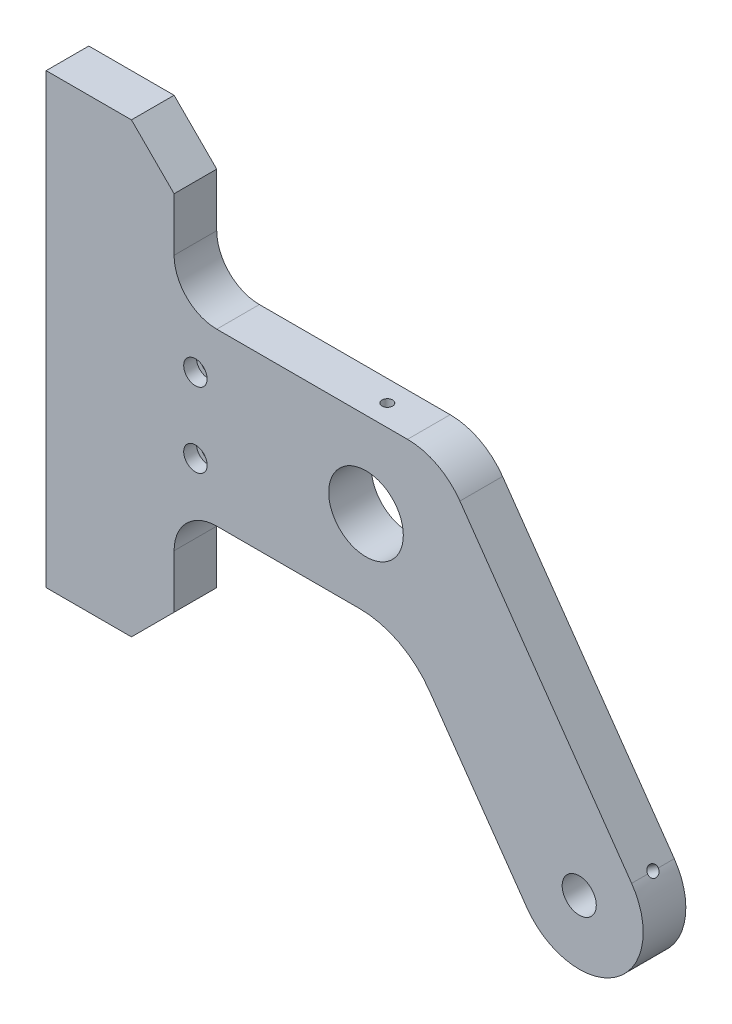
ISO-10303-21;
HEADER;
FILE_DESCRIPTION(('STEP AP214'),'2;1');
FILE_NAME('part.step','',(''),(''),'','','');
FILE_SCHEMA(('AUTOMOTIVE_DESIGN { 1 0 10303 214 1 1 1 1 }'));
ENDSEC;
DATA;
#1=APPLICATION_CONTEXT('core data for automotive mechanical design processes');
#2=APPLICATION_PROTOCOL_DEFINITION('international standard','automotive_design',2000,#1);
#3=PRODUCT_CONTEXT('',#1,'mechanical');
#4=PRODUCT('Part','Part','',(#3));
#5=PRODUCT_RELATED_PRODUCT_CATEGORY('part','',(#4));
#6=PRODUCT_DEFINITION_FORMATION('','',#4);
#7=PRODUCT_DEFINITION_CONTEXT('part definition',#1,'design');
#8=PRODUCT_DEFINITION('design','',#6,#7);
#9=PRODUCT_DEFINITION_SHAPE('','',#8);
#10=(LENGTH_UNIT() NAMED_UNIT(*) SI_UNIT(.MILLI.,.METRE.));
#11=(NAMED_UNIT(*) PLANE_ANGLE_UNIT() SI_UNIT($,.RADIAN.));
#12=(NAMED_UNIT(*) SI_UNIT($,.STERADIAN.) SOLID_ANGLE_UNIT());
#13=UNCERTAINTY_MEASURE_WITH_UNIT(LENGTH_MEASURE(1.E-05),#10,'distance_accuracy_value','');
#14=(GEOMETRIC_REPRESENTATION_CONTEXT(3) GLOBAL_UNCERTAINTY_ASSIGNED_CONTEXT((#13)) GLOBAL_UNIT_ASSIGNED_CONTEXT((#10,
#11,#12)) REPRESENTATION_CONTEXT('',''));
#15=CARTESIAN_POINT('',(0.,0.,0.));
#16=DIRECTION('',(0.,0.,1.));
#17=DIRECTION('',(1.,0.,0.));
#18=AXIS2_PLACEMENT_3D('',#15,#16,#17);
#19=CARTESIAN_POINT('',(60.,145.,10.));
#20=DIRECTION('',(-1.,0.,0.));
#21=DIRECTION('',(0.,-1.,0.));
#22=AXIS2_PLACEMENT_3D('',#19,#20,#21);
#23=PLANE('',#22);
#24=DIRECTION('',(0.,1.,0.));
#25=VECTOR('',#24,1.);
#26=CARTESIAN_POINT('',(60.,145.,10.));
#27=LINE('',#26,#25);
#28=CARTESIAN_POINT('',(60.,165.,10.));
#29=VERTEX_POINT('',#28);
#30=CARTESIAN_POINT('',(60.,190.,10.));
#31=VERTEX_POINT('',#30);
#32=EDGE_CURVE('E256',#29,#31,#27,.T.);
#33=ORIENTED_EDGE('',*,*,#32,.F.);
#34=DIRECTION('',(0.,0.,-1.));
#35=VECTOR('',#34,1.);
#36=CARTESIAN_POINT('',(60.,165.,-10.));
#37=LINE('',#36,#35);
#38=CARTESIAN_POINT('',(60.,165.,-10.));
#39=VERTEX_POINT('',#38);
#40=EDGE_CURVE('E341',#29,#39,#37,.T.);
#41=ORIENTED_EDGE('',*,*,#40,.T.);
#42=DIRECTION('',(0.,1.,0.));
#43=VECTOR('',#42,1.);
#44=CARTESIAN_POINT('',(60.,145.,-10.));
#45=LINE('',#44,#43);
#46=CARTESIAN_POINT('',(60.,190.,-10.));
#47=VERTEX_POINT('',#46);
#48=EDGE_CURVE('E255',#39,#47,#45,.T.);
#49=ORIENTED_EDGE('',*,*,#48,.T.);
#50=DIRECTION('',(0.,0.,1.));
#51=VECTOR('',#50,1.);
#52=CARTESIAN_POINT('',(60.,190.,10.));
#53=LINE('',#52,#51);
#54=EDGE_CURVE('E333',#47,#31,#53,.T.);
#55=ORIENTED_EDGE('',*,*,#54,.T.);
#56=EDGE_LOOP('',(#33,#41,#49,#55));
#57=FACE_BOUND('',#56,.T.);
#58=ADVANCED_FACE('F38',(#57),#23,.F.);
#59=CARTESIAN_POINT('',(0.,210.,10.));
#60=DIRECTION('',(0.,-1.,0.));
#61=DIRECTION('',(0.,0.,-1.));
#62=AXIS2_PLACEMENT_3D('',#59,#60,#61);
#63=PLANE('',#62);
#64=DIRECTION('',(-1.,0.,0.));
#65=VECTOR('',#64,1.);
#66=CARTESIAN_POINT('',(0.,210.,10.));
#67=LINE('',#66,#65);
#68=CARTESIAN_POINT('',(40.,210.,10.));
#69=VERTEX_POINT('',#68);
#70=CARTESIAN_POINT('',(0.,210.,10.));
#71=VERTEX_POINT('',#70);
#72=EDGE_CURVE('E258',#69,#71,#67,.T.);
#73=ORIENTED_EDGE('',*,*,#72,.F.);
#74=DIRECTION('',(0.,0.,-1.));
#75=VECTOR('',#74,1.);
#76=CARTESIAN_POINT('',(40.,210.,10.));
#77=LINE('',#76,#75);
#78=CARTESIAN_POINT('',(40.,210.,-10.));
#79=VERTEX_POINT('',#78);
#80=EDGE_CURVE('E330',#69,#79,#77,.T.);
#81=ORIENTED_EDGE('',*,*,#80,.T.);
#82=DIRECTION('',(-1.,0.,0.));
#83=VECTOR('',#82,1.);
#84=CARTESIAN_POINT('',(0.,210.,-10.));
#85=LINE('',#84,#83);
#86=CARTESIAN_POINT('',(0.,210.,-10.));
#87=VERTEX_POINT('',#86);
#88=EDGE_CURVE('E283',#79,#87,#85,.T.);
#89=ORIENTED_EDGE('',*,*,#88,.T.);
#90=DIRECTION('',(0.,0.,-1.));
#91=VECTOR('',#90,1.);
#92=CARTESIAN_POINT('',(0.,210.,10.));
#93=LINE('',#92,#91);
#94=EDGE_CURVE('E313',#71,#87,#93,.T.);
#95=ORIENTED_EDGE('',*,*,#94,.F.);
#96=EDGE_LOOP('',(#73,#81,#89,#95));
#97=FACE_BOUND('',#96,.T.);
#98=ADVANCED_FACE('F394',(#97),#63,.F.);
#99=CARTESIAN_POINT('',(0.,210.,10.));
#100=DIRECTION('',(1.,0.,0.));
#101=DIRECTION('',(0.,0.,-1.));
#102=AXIS2_PLACEMENT_3D('',#99,#100,#101);
#103=PLANE('',#102);
#104=CARTESIAN_POINT('',(0.,195.,0.));
#105=DIRECTION('',(-1.,0.,0.));
#106=DIRECTION('',(0.,0.,1.));
#107=AXIS2_PLACEMENT_3D('',#104,#105,#106);
#108=CIRCLE('',#107,4.25);
#109=CARTESIAN_POINT('',(0.,195.,4.24999999999999));
#110=VERTEX_POINT('',#109);
#111=EDGE_CURVE('E231',#110,#110,#108,.T.);
#112=ORIENTED_EDGE('',*,*,#111,.F.);
#113=EDGE_LOOP('',(#112));
#114=FACE_BOUND('',#113,.T.);
#115=CARTESIAN_POINT('',(0.,135.,0.));
#116=DIRECTION('',(-1.,0.,0.));
#117=DIRECTION('',(0.,0.,1.));
#118=AXIS2_PLACEMENT_3D('',#115,#116,#117);
#119=CIRCLE('',#118,4.25);
#120=CARTESIAN_POINT('',(0.,135.,4.25000000000001));
#121=VERTEX_POINT('',#120);
#122=EDGE_CURVE('E237',#121,#121,#119,.T.);
#123=ORIENTED_EDGE('',*,*,#122,.F.);
#124=EDGE_LOOP('',(#123));
#125=FACE_BOUND('',#124,.T.);
#126=CARTESIAN_POINT('',(0.,75.,0.));
#127=DIRECTION('',(-1.,0.,0.));
#128=DIRECTION('',(0.,0.,1.));
#129=AXIS2_PLACEMENT_3D('',#126,#127,#128);
#130=CIRCLE('',#129,4.25);
#131=CARTESIAN_POINT('',(0.,75.,4.25000000000001));
#132=VERTEX_POINT('',#131);
#133=EDGE_CURVE('E243',#132,#132,#130,.T.);
#134=ORIENTED_EDGE('',*,*,#133,.F.);
#135=EDGE_LOOP('',(#134));
#136=FACE_BOUND('',#135,.T.);
#137=CARTESIAN_POINT('',(0.,15.,0.));
#138=DIRECTION('',(-1.,0.,0.));
#139=DIRECTION('',(0.,0.,1.));
#140=AXIS2_PLACEMENT_3D('',#137,#138,#139);
#141=CIRCLE('',#140,4.25);
#142=CARTESIAN_POINT('',(0.,15.,4.25000000000001));
#143=VERTEX_POINT('',#142);
#144=EDGE_CURVE('E249',#143,#143,#141,.T.);
#145=ORIENTED_EDGE('',*,*,#144,.F.);
#146=EDGE_LOOP('',(#145));
#147=FACE_BOUND('',#146,.T.);
#148=DIRECTION('',(0.,-1.,0.));
#149=VECTOR('',#148,1.);
#150=CARTESIAN_POINT('',(0.,210.,-10.));
#151=LINE('',#150,#149);
#152=CARTESIAN_POINT('',(0.,0.,-10.));
#153=VERTEX_POINT('',#152);
#154=EDGE_CURVE('E285',#87,#153,#151,.T.);
#155=ORIENTED_EDGE('',*,*,#154,.T.);
#156=DIRECTION('',(0.,0.,-1.));
#157=VECTOR('',#156,1.);
#158=CARTESIAN_POINT('',(0.,0.,10.));
#159=LINE('',#158,#157);
#160=CARTESIAN_POINT('',(0.,0.,10.));
#161=VERTEX_POINT('',#160);
#162=EDGE_CURVE('E310',#161,#153,#159,.T.);
#163=ORIENTED_EDGE('',*,*,#162,.F.);
#164=DIRECTION('',(0.,-1.,0.));
#165=VECTOR('',#164,1.);
#166=CARTESIAN_POINT('',(0.,210.,10.));
#167=LINE('',#166,#165);
#168=EDGE_CURVE('E261',#71,#161,#167,.T.);
#169=ORIENTED_EDGE('',*,*,#168,.F.);
#170=ORIENTED_EDGE('',*,*,#94,.T.);
#171=EDGE_LOOP('',(#155,#163,#169,#170));
#172=FACE_BOUND('',#171,.T.);
#173=ADVANCED_FACE('F400',(#114,#125,#136,#147,#172),#103,.F.);
#174=CARTESIAN_POINT('',(60.0000000000001,0.,10.));
#175=DIRECTION('',(0.,1.,0.));
#176=DIRECTION('',(0.,0.,1.));
#177=AXIS2_PLACEMENT_3D('',#174,#175,#176);
#178=PLANE('',#177);
#179=DIRECTION('',(1.,0.,0.));
#180=VECTOR('',#179,1.);
#181=CARTESIAN_POINT('',(60.0000000000001,0.,-10.));
#182=LINE('',#181,#180);
#183=CARTESIAN_POINT('',(40.,0.,-10.));
#184=VERTEX_POINT('',#183);
#185=EDGE_CURVE('E287',#153,#184,#182,.T.);
#186=ORIENTED_EDGE('',*,*,#185,.T.);
#187=DIRECTION('',(0.,0.,1.));
#188=VECTOR('',#187,1.);
#189=CARTESIAN_POINT('',(40.,0.,10.));
#190=LINE('',#189,#188);
#191=CARTESIAN_POINT('',(40.,0.,10.));
#192=VERTEX_POINT('',#191);
#193=EDGE_CURVE('E324',#184,#192,#190,.T.);
#194=ORIENTED_EDGE('',*,*,#193,.T.);
#195=DIRECTION('',(1.,0.,0.));
#196=VECTOR('',#195,1.);
#197=CARTESIAN_POINT('',(60.0000000000001,0.,10.));
#198=LINE('',#197,#196);
#199=EDGE_CURVE('E263',#161,#192,#198,.T.);
#200=ORIENTED_EDGE('',*,*,#199,.F.);
#201=ORIENTED_EDGE('',*,*,#162,.T.);
#202=EDGE_LOOP('',(#186,#194,#200,#201));
#203=FACE_BOUND('',#202,.T.);
#204=ADVANCED_FACE('F502',(#203),#178,.F.);
#205=CARTESIAN_POINT('',(60.,65.,10.));
#206=DIRECTION('',(-1.,0.,0.));
#207=DIRECTION('',(0.,-1.,0.));
#208=AXIS2_PLACEMENT_3D('',#205,#206,#207);
#209=PLANE('',#208);
#210=DIRECTION('',(0.,1.,0.));
#211=VECTOR('',#210,1.);
#212=CARTESIAN_POINT('',(60.,65.,-10.));
#213=LINE('',#212,#211);
#214=CARTESIAN_POINT('',(60.0000000000001,20.,-10.));
#215=VERTEX_POINT('',#214);
#216=CARTESIAN_POINT('',(60.,45.,-10.));
#217=VERTEX_POINT('',#216);
#218=EDGE_CURVE('E290',#215,#217,#213,.T.);
#219=ORIENTED_EDGE('',*,*,#218,.T.);
#220=DIRECTION('',(0.,0.,-1.));
#221=VECTOR('',#220,1.);
#222=CARTESIAN_POINT('',(60.,45.,10.));
#223=LINE('',#222,#221);
#224=CARTESIAN_POINT('',(60.,45.,10.));
#225=VERTEX_POINT('',#224);
#226=EDGE_CURVE('E339',#217,#225,#223,.F.);
#227=ORIENTED_EDGE('',*,*,#226,.T.);
#228=DIRECTION('',(0.,1.,0.));
#229=VECTOR('',#228,1.);
#230=CARTESIAN_POINT('',(60.,65.,10.));
#231=LINE('',#230,#229);
#232=CARTESIAN_POINT('',(60.,19.9999999999999,10.));
#233=VERTEX_POINT('',#232);
#234=EDGE_CURVE('E266',#233,#225,#231,.T.);
#235=ORIENTED_EDGE('',*,*,#234,.F.);
#236=DIRECTION('',(0.,0.,-1.));
#237=VECTOR('',#236,1.);
#238=CARTESIAN_POINT('',(60.,20.,10.));
#239=LINE('',#238,#237);
#240=EDGE_CURVE('E316',#233,#215,#239,.T.);
#241=ORIENTED_EDGE('',*,*,#240,.T.);
#242=EDGE_LOOP('',(#219,#227,#235,#241));
#243=FACE_BOUND('',#242,.T.);
#244=ADVANCED_FACE('F461',(#243),#209,.F.);
#245=CARTESIAN_POINT('',(60.,65.,10.));
#246=DIRECTION('',(0.,1.,0.));
#247=DIRECTION('',(0.,0.,1.));
#248=AXIS2_PLACEMENT_3D('',#245,#246,#247);
#249=PLANE('',#248);
#250=DIRECTION('',(1.,0.,0.));
#251=VECTOR('',#250,1.);
#252=CARTESIAN_POINT('',(60.,65.,-10.));
#253=LINE('',#252,#251);
#254=CARTESIAN_POINT('',(80.,65.,-10.));
#255=VERTEX_POINT('',#254);
#256=CARTESIAN_POINT('',(147.040590331456,65.,-10.));
#257=VERTEX_POINT('',#256);
#258=EDGE_CURVE('E293',#255,#257,#253,.T.);
#259=ORIENTED_EDGE('',*,*,#258,.T.);
#260=DIRECTION('',(0.,0.,-1.));
#261=VECTOR('',#260,1.);
#262=CARTESIAN_POINT('',(147.040590331456,65.,10.));
#263=LINE('',#262,#261);
#264=CARTESIAN_POINT('',(147.040590331456,65.,10.));
#265=VERTEX_POINT('',#264);
#266=EDGE_CURVE('E368',#257,#265,#263,.F.);
#267=ORIENTED_EDGE('',*,*,#266,.T.);
#268=DIRECTION('',(1.,0.,0.));
#269=VECTOR('',#268,1.);
#270=CARTESIAN_POINT('',(60.,65.,10.));
#271=LINE('',#270,#269);
#272=CARTESIAN_POINT('',(80.,65.,10.));
#273=VERTEX_POINT('',#272);
#274=EDGE_CURVE('E269',#273,#265,#271,.T.);
#275=ORIENTED_EDGE('',*,*,#274,.F.);
#276=DIRECTION('',(0.,0.,-1.));
#277=VECTOR('',#276,1.);
#278=CARTESIAN_POINT('',(80.,65.,-10.));
#279=LINE('',#278,#277);
#280=EDGE_CURVE('E336',#273,#255,#279,.T.);
#281=ORIENTED_EDGE('',*,*,#280,.T.);
#282=EDGE_LOOP('',(#259,#267,#275,#281));
#283=FACE_BOUND('',#282,.T.);
#284=ADVANCED_FACE('F468',(#283),#249,.F.);
#285=CARTESIAN_POINT('',(167.863272353526,65.,10.));
#286=DIRECTION('',(0.819152044288993,0.573576436351044,0.));
#287=DIRECTION('',(-0.573576436351044,0.819152044288993,0.));
#288=AXIS2_PLACEMENT_3D('',#285,#286,#287);
#289=PLANE('',#288);
#290=DIRECTION('',(0.573576436351044,-0.819152044288993,0.));
#291=VECTOR('',#290,1.);
#292=CARTESIAN_POINT('',(167.863272353526,65.,10.));
#293=LINE('',#292,#291);
#294=CARTESIAN_POINT('',(179.806672103015,47.9430574540418,10.));
#295=VERTEX_POINT('',#294);
#296=CARTESIAN_POINT('',(225.42543867133,-17.2072930905313,10.));
#297=VERTEX_POINT('',#296);
#298=EDGE_CURVE('E272',#295,#297,#293,.T.);
#299=ORIENTED_EDGE('',*,*,#298,.F.);
#300=DIRECTION('',(0.,0.,-1.));
#301=VECTOR('',#300,1.);
#302=CARTESIAN_POINT('',(179.806672103015,47.9430574540418,-10.));
#303=LINE('',#302,#301);
#304=CARTESIAN_POINT('',(179.806672103015,47.9430574540418,-10.));
#305=VERTEX_POINT('',#304);
#306=EDGE_CURVE('E365',#295,#305,#303,.T.);
#307=ORIENTED_EDGE('',*,*,#306,.T.);
#308=DIRECTION('',(0.573576436351044,-0.819152044288993,0.));
#309=VECTOR('',#308,1.);
#310=CARTESIAN_POINT('',(167.863272353526,65.,-10.));
#311=LINE('',#310,#309);
#312=CARTESIAN_POINT('',(225.42543867133,-17.2072930905313,-10.));
#313=VERTEX_POINT('',#312);
#314=EDGE_CURVE('E295',#305,#313,#311,.T.);
#315=ORIENTED_EDGE('',*,*,#314,.T.);
#316=DIRECTION('',(0.,0.,-1.));
#317=VECTOR('',#316,1.);
#318=CARTESIAN_POINT('',(225.42543867133,-17.2072930905313,10.));
#319=LINE('',#318,#317);
#320=EDGE_CURVE('E307',#297,#313,#319,.T.);
#321=ORIENTED_EDGE('',*,*,#320,.F.);
#322=EDGE_LOOP('',(#299,#307,#315,#321));
#323=FACE_BOUND('',#322,.T.);
#324=ADVANCED_FACE('F474',(#323),#289,.F.);
#325=CARTESIAN_POINT('',(250.,0.,10.));
#326=DIRECTION('',(0.,0.,-1.));
#327=DIRECTION('',(-1.,0.,0.));
#328=AXIS2_PLACEMENT_3D('',#325,#326,#327);
#329=CYLINDRICAL_SURFACE('',#328,30.);
#330=DIRECTION('',(0.,0.,-1.));
#331=VECTOR('',#330,1.);
#332=CARTESIAN_POINT('',(274.57456132867,17.2072930905313,10.));
#333=LINE('',#332,#331);
#334=CARTESIAN_POINT('',(274.57456132867,17.2072930905313,-2.5));
#335=VERTEX_POINT('',#334);
#336=CARTESIAN_POINT('',(274.57456132867,17.2072930905313,-10.));
#337=VERTEX_POINT('',#336);
#338=EDGE_CURVE('E281',#335,#337,#333,.T.);
#339=ORIENTED_EDGE('',*,*,#338,.F.);
#340=CARTESIAN_POINT('',(274.57456132867,17.2072930905313,-2.5));
#341=CARTESIAN_POINT('',(274.61481999473,17.1498019203188,-2.500006877275));
#342=CARTESIAN_POINT('',(274.654871106441,17.0921695184484,-2.49704443774055));
#343=CARTESIAN_POINT('',(274.734287166767,16.9770401153053,-2.48523416927883));
#344=CARTESIAN_POINT('',(274.773652156812,16.9195431060398,-2.47638669697652));
#345=CARTESIAN_POINT('',(274.851397027578,16.8051436013599,-2.45286952773237));
#346=CARTESIAN_POINT('',(274.889777712011,16.7482406449598,-2.43820475308302));
#347=CARTESIAN_POINT('',(274.965326220443,16.6354172116039,-2.40317382061259));
#348=CARTESIAN_POINT('',(275.002494055907,16.5794967253644,-2.3828077166966));
#349=CARTESIAN_POINT('',(275.111853140987,16.413782952398,-2.31332896419825));
#350=CARTESIAN_POINT('',(275.181937690694,16.3059817300875,-2.25582438256133));
#351=CARTESIAN_POINT('',(275.31460761795,16.0992479709045,-2.12016896488944));
#352=CARTESIAN_POINT('',(275.377194074134,16.0003141589309,-2.04202110368186));
#353=CARTESIAN_POINT('',(275.493683162479,15.8140512954777,-1.86706855029736));
#354=CARTESIAN_POINT('',(275.547566652312,15.7267478971895,-1.77022373318934));
#355=CARTESIAN_POINT('',(275.645371669829,15.5667508837973,-1.56070463863823));
#356=CARTESIAN_POINT('',(275.689291677398,15.4940594982203,-1.44802794998928));
#357=CARTESIAN_POINT('',(275.766371297649,15.3655378398461,-1.20985117256001));
#358=CARTESIAN_POINT('',(275.799515391872,15.3097318918182,-1.08433292932385));
#359=CARTESIAN_POINT('',(275.854340809412,15.2169636314275,-0.824171023758104));
#360=CARTESIAN_POINT('',(275.87602303169,15.1799998412745,-0.689528078017478));
#361=CARTESIAN_POINT('',(275.907503404368,15.1262105751377,-0.415263218903863));
#362=CARTESIAN_POINT('',(275.91732903418,15.1093385347437,-0.27565359335934));
#363=CARTESIAN_POINT('',(275.925015104965,15.0961469636475,0.00486204201485029));
#364=CARTESIAN_POINT('',(275.922875476762,15.0998275517684,0.145768059334784));
#365=CARTESIAN_POINT('',(275.906688959481,15.1275813742875,0.424499498546434));
#366=CARTESIAN_POINT('',(275.892672061787,15.1516032446551,0.562331783059617));
#367=CARTESIAN_POINT('',(275.85301690918,15.2191667973535,0.831380295288021));
#368=CARTESIAN_POINT('',(275.827378596165,15.2627085772756,0.962596489921973));
#369=CARTESIAN_POINT('',(275.764900075831,15.3679424342488,1.21488016249687));
#370=CARTESIAN_POINT('',(275.728045647694,15.4296575498796,1.33593450626654));
#371=CARTESIAN_POINT('',(275.643833009399,15.5692147404415,1.56430830345195));
#372=CARTESIAN_POINT('',(275.596475068604,15.6470564018017,1.67162810898053));
#373=CARTESIAN_POINT('',(275.492030556044,15.8166463840881,1.86982327032534));
#374=CARTESIAN_POINT('',(275.434915944178,15.9084347003992,1.96064962775038));
#375=CARTESIAN_POINT('',(275.312233973644,16.1029191479106,2.122927357614));
#376=CARTESIAN_POINT('',(275.24666401998,16.2056186261008,2.19437276094191));
#377=CARTESIAN_POINT('',(275.108548025427,16.4187989146002,2.31585475750467));
#378=CARTESIAN_POINT('',(275.035997111197,16.5292851461585,2.36587626017093));
#379=CARTESIAN_POINT('',(274.885789479614,16.7545731613126,2.44293745621851));
#380=CARTESIAN_POINT('',(274.808140699051,16.8693681227111,2.47001200216307));
#381=CARTESIAN_POINT('',(274.703548963225,17.0216546425912,2.49017420161541));
#382=CARTESIAN_POINT('',(274.677890943428,17.0588321640836,2.4938607445247));
#383=CARTESIAN_POINT('',(274.626373694636,17.1331184754711,2.49877030379815));
#384=CARTESIAN_POINT('',(274.60051487261,17.1702272765812,2.49999741876936));
#385=CARTESIAN_POINT('',(274.57456132867,17.2072930905313,2.5));
#386=B_SPLINE_CURVE_WITH_KNOTS('',3,(#340,#341,#342,#343,#344,#345,#346,#347,#348,#349,#350,
#351,#352,#353,#354,#355,#356,#357,#358,#359,#360,#361,#362,#363,#364,#365,#366,#367,#368,#369,
#370,#371,#372,#373,#374,#375,#376,#377,#378,#379,#380,#381,#382,#383,#384,#385),.UNSPECIFIED.,
.F.,.F.,(4,2,2,2,2,2,2,2,2,2,2,2,2,2,2,2,2,2,2,2,2,2,4),(0.,0.210487340073488,0.420961926063155,
0.631258798214532,0.841553682111946,1.26194148167382,1.68226873370753,2.10350827023465,
2.52481203153826,2.94671985492192,3.36859458298909,3.78948966423426,4.2103871788481,
4.63022503825764,5.0500649967004,5.47043950013234,5.89080322424802,6.3123960244243,
6.73411852328504,7.15613758847022,7.57751452321119,7.71343288735025,7.84912455620549),.UNSPECIFIED.);
#387=CARTESIAN_POINT('',(274.57456132867,17.2072930905313,2.5));
#388=VERTEX_POINT('',#387);
#389=EDGE_CURVE('E11',#335,#388,#386,.T.);
#390=ORIENTED_EDGE('',*,*,#389,.T.);
#391=CARTESIAN_POINT('',(274.57456132867,17.2072930905313,10.));
#392=VERTEX_POINT('',#391);
#393=EDGE_CURVE('E304',#392,#388,#333,.T.);
#394=ORIENTED_EDGE('',*,*,#393,.F.);
#395=CARTESIAN_POINT('',(250.,0.,10.));
#396=DIRECTION('',(0.,0.,1.));
#397=DIRECTION('',(1.,0.,0.));
#398=AXIS2_PLACEMENT_3D('',#395,#396,#397);
#399=CIRCLE('',#398,30.);
#400=EDGE_CURVE('E274',#297,#392,#399,.T.);
#401=ORIENTED_EDGE('',*,*,#400,.F.);
#402=ORIENTED_EDGE('',*,*,#320,.T.);
#403=CARTESIAN_POINT('',(250.,0.,-10.));
#404=DIRECTION('',(0.,0.,1.));
#405=DIRECTION('',(1.,0.,0.));
#406=AXIS2_PLACEMENT_3D('',#403,#404,#405);
#407=CIRCLE('',#406,30.);
#408=EDGE_CURVE('E297',#313,#337,#407,.T.);
#409=ORIENTED_EDGE('',*,*,#408,.T.);
#410=EDGE_LOOP('',(#339,#390,#394,#401,#402,#409));
#411=FACE_BOUND('',#410,.T.);
#412=ADVANCED_FACE('F480',(#411),#329,.T.);
#413=CARTESIAN_POINT('',(274.57456132867,17.2072930905313,10.));
#414=DIRECTION('',(-0.819152044288993,-0.573576436351044,0.));
#415=DIRECTION('',(0.573576436351044,-0.819152044288993,0.));
#416=AXIS2_PLACEMENT_3D('',#413,#414,#415);
#417=PLANE('',#416);
#418=ORIENTED_EDGE('',*,*,#393,.T.);
#419=CARTESIAN_POINT('',(274.57456132867,17.2072930905313,0.));
#420=DIRECTION('',(0.819152044288993,0.573576436351044,0.));
#421=DIRECTION('',(-0.573576436351044,0.819152044288993,0.));
#422=AXIS2_PLACEMENT_3D('',#419,#420,#421);
#423=CIRCLE('',#422,2.5);
#424=EDGE_CURVE('E58',#335,#388,#423,.T.);
#425=ORIENTED_EDGE('',*,*,#424,.F.);
#426=ORIENTED_EDGE('',*,*,#338,.T.);
#427=DIRECTION('',(-0.573576436351044,0.819152044288993,0.));
#428=VECTOR('',#427,1.);
#429=CARTESIAN_POINT('',(274.57456132867,17.2072930905313,-10.));
#430=LINE('',#429,#428);
#431=CARTESIAN_POINT('',(194.050694434554,132.207293090531,-10.));
#432=VERTEX_POINT('',#431);
#433=EDGE_CURVE('E300',#337,#432,#430,.T.);
#434=ORIENTED_EDGE('',*,*,#433,.T.);
#435=DIRECTION('',(0.,0.,-1.));
#436=VECTOR('',#435,1.);
#437=CARTESIAN_POINT('',(194.050694434554,132.207293090531,10.));
#438=LINE('',#437,#436);
#439=CARTESIAN_POINT('',(194.050694434554,132.207293090531,10.));
#440=VERTEX_POINT('',#439);
#441=EDGE_CURVE('E361',#432,#440,#438,.F.);
#442=ORIENTED_EDGE('',*,*,#441,.T.);
#443=DIRECTION('',(-0.573576436351044,0.819152044288993,0.));
#444=VECTOR('',#443,1.);
#445=CARTESIAN_POINT('',(274.57456132867,17.2072930905313,10.));
#446=LINE('',#445,#444);
#447=EDGE_CURVE('E276',#392,#440,#446,.T.);
#448=ORIENTED_EDGE('',*,*,#447,.F.);
#449=EDGE_LOOP('',(#418,#425,#426,#434,#442,#448));
#450=FACE_BOUND('',#449,.T.);
#451=ADVANCED_FACE('F484',(#450),#417,.F.);
#452=CARTESIAN_POINT('',(185.093144622436,145.,10.));
#453=DIRECTION('',(0.,-1.,0.));
#454=DIRECTION('',(1.,0.,0.));
#455=AXIS2_PLACEMENT_3D('',#452,#453,#454);
#456=PLANE('',#455);
#457=CARTESIAN_POINT('',(150.,145.,0.));
#458=DIRECTION('',(0.,1.,0.));
#459=DIRECTION('',(0.,0.,1.));
#460=AXIS2_PLACEMENT_3D('',#457,#458,#459);
#461=CIRCLE('',#460,2.5);
#462=CARTESIAN_POINT('',(150.,145.,2.5));
#463=VERTEX_POINT('',#462);
#464=EDGE_CURVE('E188',#463,#463,#461,.T.);
#465=ORIENTED_EDGE('',*,*,#464,.F.);
#466=EDGE_LOOP('',(#465));
#467=FACE_BOUND('',#466,.T.);
#468=DIRECTION('',(-1.,0.,0.));
#469=VECTOR('',#468,1.);
#470=CARTESIAN_POINT('',(185.093144622436,145.,10.));
#471=LINE('',#470,#469);
#472=CARTESIAN_POINT('',(169.476133105884,145.,10.));
#473=VERTEX_POINT('',#472);
#474=CARTESIAN_POINT('',(80.,145.,10.));
#475=VERTEX_POINT('',#474);
#476=EDGE_CURVE('E279',#473,#475,#471,.T.);
#477=ORIENTED_EDGE('',*,*,#476,.F.);
#478=DIRECTION('',(0.,0.,-1.));
#479=VECTOR('',#478,1.);
#480=CARTESIAN_POINT('',(169.476133105884,145.,10.));
#481=LINE('',#480,#479);
#482=CARTESIAN_POINT('',(169.476133105884,145.,-10.));
#483=VERTEX_POINT('',#482);
#484=EDGE_CURVE('E356',#473,#483,#481,.T.);
#485=ORIENTED_EDGE('',*,*,#484,.T.);
#486=DIRECTION('',(-1.,0.,0.));
#487=VECTOR('',#486,1.);
#488=CARTESIAN_POINT('',(185.093144622436,145.,-10.));
#489=LINE('',#488,#487);
#490=CARTESIAN_POINT('',(80.,145.,-10.));
#491=VERTEX_POINT('',#490);
#492=EDGE_CURVE('E259',#483,#491,#489,.T.);
#493=ORIENTED_EDGE('',*,*,#492,.T.);
#494=DIRECTION('',(0.,0.,-1.));
#495=VECTOR('',#494,1.);
#496=CARTESIAN_POINT('',(80.,145.,10.));
#497=LINE('',#496,#495);
#498=EDGE_CURVE('E344',#491,#475,#497,.F.);
#499=ORIENTED_EDGE('',*,*,#498,.T.);
#500=EDGE_LOOP('',(#477,#485,#493,#499));
#501=FACE_BOUND('',#500,.T.);
#502=ADVANCED_FACE('F437',(#467,#501),#456,.F.);
#503=CARTESIAN_POINT('',(250.,0.,10.));
#504=DIRECTION('',(0.,0.,1.));
#505=DIRECTION('',(1.,0.,0.));
#506=AXIS2_PLACEMENT_3D('',#503,#504,#505);
#507=PLANE('',#506);
#508=CARTESIAN_POINT('',(250.,0.,10.));
#509=DIRECTION('',(0.,0.,1.));
#510=DIRECTION('',(1.,0.,0.));
#511=AXIS2_PLACEMENT_3D('',#508,#509,#510);
#512=CIRCLE('',#511,8.00000000000001);
#513=CARTESIAN_POINT('',(258.,0.,10.));
#514=VERTEX_POINT('',#513);
#515=EDGE_CURVE('E197',#514,#514,#512,.T.);
#516=ORIENTED_EDGE('',*,*,#515,.F.);
#517=EDGE_LOOP('',(#516));
#518=FACE_BOUND('',#517,.T.);
#519=CARTESIAN_POINT('',(150.,105.,10.));
#520=DIRECTION('',(0.,0.,1.));
#521=DIRECTION('',(1.,0.,0.));
#522=AXIS2_PLACEMENT_3D('',#519,#520,#521);
#523=CIRCLE('',#522,17.5);
#524=CARTESIAN_POINT('',(167.5,105.,10.));
#525=VERTEX_POINT('',#524);
#526=EDGE_CURVE('E201',#525,#525,#523,.T.);
#527=ORIENTED_EDGE('',*,*,#526,.F.);
#528=EDGE_LOOP('',(#527));
#529=FACE_BOUND('',#528,.T.);
#530=CARTESIAN_POINT('',(70.,122.5,10.));
#531=DIRECTION('',(0.,0.,1.));
#532=DIRECTION('',(1.,0.,0.));
#533=AXIS2_PLACEMENT_3D('',#530,#531,#532);
#534=CIRCLE('',#533,5.49999999999999);
#535=CARTESIAN_POINT('',(75.5,122.5,10.));
#536=VERTEX_POINT('',#535);
#537=EDGE_CURVE('E207',#536,#536,#534,.T.);
#538=ORIENTED_EDGE('',*,*,#537,.F.);
#539=EDGE_LOOP('',(#538));
#540=FACE_BOUND('',#539,.T.);
#541=CARTESIAN_POINT('',(70.,87.5,10.));
#542=DIRECTION('',(0.,0.,1.));
#543=DIRECTION('',(1.,0.,0.));
#544=AXIS2_PLACEMENT_3D('',#541,#542,#543);
#545=CIRCLE('',#544,5.49999999999999);
#546=CARTESIAN_POINT('',(75.5,87.5,10.));
#547=VERTEX_POINT('',#546);
#548=EDGE_CURVE('E219',#547,#547,#545,.T.);
#549=ORIENTED_EDGE('',*,*,#548,.F.);
#550=EDGE_LOOP('',(#549));
#551=FACE_BOUND('',#550,.T.);
#552=ORIENTED_EDGE('',*,*,#447,.T.);
#553=CARTESIAN_POINT('',(169.476133105884,115.,10.));
#554=DIRECTION('',(0.,0.,1.));
#555=DIRECTION('',(1.,0.,0.));
#556=AXIS2_PLACEMENT_3D('',#553,#554,#555);
#557=CIRCLE('',#556,30.);
#558=EDGE_CURVE('E363',#440,#473,#557,.T.);
#559=ORIENTED_EDGE('',*,*,#558,.T.);
#560=ORIENTED_EDGE('',*,*,#476,.T.);
#561=CARTESIAN_POINT('',(80.,165.,10.));
#562=DIRECTION('',(0.,0.,1.));
#563=DIRECTION('',(1.,0.,0.));
#564=AXIS2_PLACEMENT_3D('',#561,#562,#563);
#565=CIRCLE('',#564,20.);
#566=EDGE_CURVE('E354',#475,#29,#565,.F.);
#567=ORIENTED_EDGE('',*,*,#566,.T.);
#568=ORIENTED_EDGE('',*,*,#32,.T.);
#569=DIRECTION('',(0.707106781186547,-0.707106781186549,0.));
#570=VECTOR('',#569,1.);
#571=CARTESIAN_POINT('',(250.,-3.27896279544569E-13,10.));
#572=LINE('',#571,#570);
#573=EDGE_CURVE('E326',#31,#69,#572,.F.);
#574=ORIENTED_EDGE('',*,*,#573,.T.);
#575=ORIENTED_EDGE('',*,*,#72,.T.);
#576=ORIENTED_EDGE('',*,*,#168,.T.);
#577=ORIENTED_EDGE('',*,*,#199,.T.);
#578=DIRECTION('',(-0.707106781186549,-0.707106781186547,0.));
#579=VECTOR('',#578,1.);
#580=CARTESIAN_POINT('',(145.,105.,10.));
#581=LINE('',#580,#579);
#582=EDGE_CURVE('E328',#192,#233,#581,.F.);
#583=ORIENTED_EDGE('',*,*,#582,.T.);
#584=ORIENTED_EDGE('',*,*,#234,.T.);
#585=CARTESIAN_POINT('',(80.,45.,10.));
#586=DIRECTION('',(0.,0.,1.));
#587=DIRECTION('',(1.,0.,0.));
#588=AXIS2_PLACEMENT_3D('',#585,#586,#587);
#589=CIRCLE('',#588,20.);
#590=EDGE_CURVE('E349',#225,#273,#589,.F.);
#591=ORIENTED_EDGE('',*,*,#590,.T.);
#592=ORIENTED_EDGE('',*,*,#274,.T.);
#593=CARTESIAN_POINT('',(147.040590331456,25.,10.));
#594=DIRECTION('',(0.,0.,1.));
#595=DIRECTION('',(1.,0.,0.));
#596=AXIS2_PLACEMENT_3D('',#593,#594,#595);
#597=CIRCLE('',#596,40.);
#598=EDGE_CURVE('E52',#265,#295,#597,.F.);
#599=ORIENTED_EDGE('',*,*,#598,.T.);
#600=ORIENTED_EDGE('',*,*,#298,.T.);
#601=ORIENTED_EDGE('',*,*,#400,.T.);
#602=EDGE_LOOP('',(#552,#559,#560,#567,#568,#574,#575,#576,#577,#583,#584,#591,#592,#599,#600,#601));
#603=FACE_BOUND('',#602,.T.);
#604=ADVANCED_FACE('F434',(#518,#529,#540,#551,#603),#507,.T.);
#605=CARTESIAN_POINT('',(250.,0.,-10.));
#606=DIRECTION('',(0.,0.,1.));
#607=DIRECTION('',(1.,0.,0.));
#608=AXIS2_PLACEMENT_3D('',#605,#606,#607);
#609=PLANE('',#608);
#610=CARTESIAN_POINT('',(250.,0.,-10.));
#611=DIRECTION('',(0.,0.,1.));
#612=DIRECTION('',(1.,0.,0.));
#613=AXIS2_PLACEMENT_3D('',#610,#611,#612);
#614=CIRCLE('',#613,8.00000000000001);
#615=CARTESIAN_POINT('',(258.,0.,-10.));
#616=VERTEX_POINT('',#615);
#617=EDGE_CURVE('E200',#616,#616,#614,.T.);
#618=ORIENTED_EDGE('',*,*,#617,.T.);
#619=EDGE_LOOP('',(#618));
#620=FACE_BOUND('',#619,.T.);
#621=CARTESIAN_POINT('',(150.,105.,-10.));
#622=DIRECTION('',(0.,0.,1.));
#623=DIRECTION('',(1.,0.,0.));
#624=AXIS2_PLACEMENT_3D('',#621,#622,#623);
#625=CIRCLE('',#624,17.5);
#626=CARTESIAN_POINT('',(167.5,105.,-10.));
#627=VERTEX_POINT('',#626);
#628=EDGE_CURVE('E204',#627,#627,#625,.T.);
#629=ORIENTED_EDGE('',*,*,#628,.T.);
#630=EDGE_LOOP('',(#629));
#631=FACE_BOUND('',#630,.T.);
#632=CARTESIAN_POINT('',(70.,122.5,-10.));
#633=DIRECTION('',(0.,0.,1.));
#634=DIRECTION('',(1.,0.,0.));
#635=AXIS2_PLACEMENT_3D('',#632,#633,#634);
#636=CIRCLE('',#635,3.24999999999999);
#637=CARTESIAN_POINT('',(73.25,122.5,-10.));
#638=VERTEX_POINT('',#637);
#639=EDGE_CURVE('E216',#638,#638,#636,.T.);
#640=ORIENTED_EDGE('',*,*,#639,.T.);
#641=EDGE_LOOP('',(#640));
#642=FACE_BOUND('',#641,.T.);
#643=CARTESIAN_POINT('',(70.,87.5,-10.));
#644=DIRECTION('',(0.,0.,1.));
#645=DIRECTION('',(1.,0.,0.));
#646=AXIS2_PLACEMENT_3D('',#643,#644,#645);
#647=CIRCLE('',#646,3.24999999999999);
#648=CARTESIAN_POINT('',(73.25,87.5,-10.));
#649=VERTEX_POINT('',#648);
#650=EDGE_CURVE('E228',#649,#649,#647,.T.);
#651=ORIENTED_EDGE('',*,*,#650,.T.);
#652=EDGE_LOOP('',(#651));
#653=FACE_BOUND('',#652,.T.);
#654=ORIENTED_EDGE('',*,*,#492,.F.);
#655=CARTESIAN_POINT('',(169.476133105884,115.,-10.));
#656=DIRECTION('',(0.,0.,1.));
#657=DIRECTION('',(1.,0.,0.));
#658=AXIS2_PLACEMENT_3D('',#655,#656,#657);
#659=CIRCLE('',#658,30.);
#660=EDGE_CURVE('E359',#483,#432,#659,.F.);
#661=ORIENTED_EDGE('',*,*,#660,.T.);
#662=ORIENTED_EDGE('',*,*,#433,.F.);
#663=ORIENTED_EDGE('',*,*,#408,.F.);
#664=ORIENTED_EDGE('',*,*,#314,.F.);
#665=CARTESIAN_POINT('',(147.040590331456,25.,-10.));
#666=DIRECTION('',(0.,0.,1.));
#667=DIRECTION('',(1.,0.,0.));
#668=AXIS2_PLACEMENT_3D('',#665,#666,#667);
#669=CIRCLE('',#668,40.);
#670=EDGE_CURVE('E65',#305,#257,#669,.T.);
#671=ORIENTED_EDGE('',*,*,#670,.T.);
#672=ORIENTED_EDGE('',*,*,#258,.F.);
#673=CARTESIAN_POINT('',(80.,45.,-10.));
#674=DIRECTION('',(0.,0.,1.));
#675=DIRECTION('',(1.,0.,0.));
#676=AXIS2_PLACEMENT_3D('',#673,#674,#675);
#677=CIRCLE('',#676,20.);
#678=EDGE_CURVE('E347',#255,#217,#677,.T.);
#679=ORIENTED_EDGE('',*,*,#678,.T.);
#680=ORIENTED_EDGE('',*,*,#218,.F.);
#681=DIRECTION('',(0.707106781186549,0.707106781186547,0.));
#682=VECTOR('',#681,1.);
#683=CARTESIAN_POINT('',(60.,20.,-10.));
#684=LINE('',#683,#682);
#685=EDGE_CURVE('E322',#215,#184,#684,.F.);
#686=ORIENTED_EDGE('',*,*,#685,.T.);
#687=ORIENTED_EDGE('',*,*,#185,.F.);
#688=ORIENTED_EDGE('',*,*,#154,.F.);
#689=ORIENTED_EDGE('',*,*,#88,.F.);
#690=DIRECTION('',(-0.707106781186547,0.707106781186549,0.));
#691=VECTOR('',#690,1.);
#692=CARTESIAN_POINT('',(40.,210.,-10.));
#693=LINE('',#692,#691);
#694=EDGE_CURVE('E319',#79,#47,#693,.F.);
#695=ORIENTED_EDGE('',*,*,#694,.T.);
#696=ORIENTED_EDGE('',*,*,#48,.F.);
#697=CARTESIAN_POINT('',(80.,165.,-10.));
#698=DIRECTION('',(0.,0.,1.));
#699=DIRECTION('',(1.,0.,0.));
#700=AXIS2_PLACEMENT_3D('',#697,#698,#699);
#701=CIRCLE('',#700,20.);
#702=EDGE_CURVE('E351',#39,#491,#701,.T.);
#703=ORIENTED_EDGE('',*,*,#702,.T.);
#704=EDGE_LOOP('',(#654,#661,#662,#663,#664,#671,#672,#679,#680,#686,#687,#688,#689,#695,#696,#703));
#705=FACE_BOUND('',#704,.T.);
#706=ADVANCED_FACE('F374',(#620,#631,#642,#653,#705),#609,.F.);
#707=CARTESIAN_POINT('',(60.,20.,10.));
#708=DIRECTION('',(-0.707106781186546,0.707106781186548,0.));
#709=DIRECTION('',(-0.707106781186549,-0.707106781186547,0.));
#710=AXIS2_PLACEMENT_3D('',#707,#708,#709);
#711=PLANE('',#710);
#712=ORIENTED_EDGE('',*,*,#582,.F.);
#713=ORIENTED_EDGE('',*,*,#193,.F.);
#714=ORIENTED_EDGE('',*,*,#685,.F.);
#715=ORIENTED_EDGE('',*,*,#240,.F.);
#716=EDGE_LOOP('',(#712,#713,#714,#715));
#717=FACE_BOUND('',#716,.T.);
#718=ADVANCED_FACE('F406',(#717),#711,.F.);
#719=CARTESIAN_POINT('',(40.,210.,10.));
#720=DIRECTION('',(-0.707106781186548,-0.707106781186546,0.));
#721=DIRECTION('',(0.707106781186547,-0.707106781186549,0.));
#722=AXIS2_PLACEMENT_3D('',#719,#720,#721);
#723=PLANE('',#722);
#724=ORIENTED_EDGE('',*,*,#573,.F.);
#725=ORIENTED_EDGE('',*,*,#54,.F.);
#726=ORIENTED_EDGE('',*,*,#694,.F.);
#727=ORIENTED_EDGE('',*,*,#80,.F.);
#728=EDGE_LOOP('',(#724,#725,#726,#727));
#729=FACE_BOUND('',#728,.T.);
#730=ADVANCED_FACE('F409',(#729),#723,.F.);
#731=CARTESIAN_POINT('',(80.,45.,10.));
#732=DIRECTION('',(0.,0.,1.));
#733=DIRECTION('',(1.,0.,0.));
#734=AXIS2_PLACEMENT_3D('',#731,#732,#733);
#735=CYLINDRICAL_SURFACE('',#734,20.);
#736=ORIENTED_EDGE('',*,*,#590,.F.);
#737=ORIENTED_EDGE('',*,*,#226,.F.);
#738=ORIENTED_EDGE('',*,*,#678,.F.);
#739=ORIENTED_EDGE('',*,*,#280,.F.);
#740=EDGE_LOOP('',(#736,#737,#738,#739));
#741=FACE_BOUND('',#740,.T.);
#742=ADVANCED_FACE('F413',(#741),#735,.F.);
#743=CARTESIAN_POINT('',(80.,165.,10.));
#744=DIRECTION('',(0.,0.,1.));
#745=DIRECTION('',(1.,0.,0.));
#746=AXIS2_PLACEMENT_3D('',#743,#744,#745);
#747=CYLINDRICAL_SURFACE('',#746,20.);
#748=ORIENTED_EDGE('',*,*,#566,.F.);
#749=ORIENTED_EDGE('',*,*,#498,.F.);
#750=ORIENTED_EDGE('',*,*,#702,.F.);
#751=ORIENTED_EDGE('',*,*,#40,.F.);
#752=EDGE_LOOP('',(#748,#749,#750,#751));
#753=FACE_BOUND('',#752,.T.);
#754=ADVANCED_FACE('F417',(#753),#747,.F.);
#755=CARTESIAN_POINT('',(169.476133105884,115.,10.));
#756=DIRECTION('',(0.,0.,-1.));
#757=DIRECTION('',(-1.,0.,0.));
#758=AXIS2_PLACEMENT_3D('',#755,#756,#757);
#759=CYLINDRICAL_SURFACE('',#758,30.);
#760=ORIENTED_EDGE('',*,*,#558,.F.);
#761=ORIENTED_EDGE('',*,*,#441,.F.);
#762=ORIENTED_EDGE('',*,*,#660,.F.);
#763=ORIENTED_EDGE('',*,*,#484,.F.);
#764=EDGE_LOOP('',(#760,#761,#762,#763));
#765=FACE_BOUND('',#764,.T.);
#766=ADVANCED_FACE('F420',(#765),#759,.T.);
#767=CARTESIAN_POINT('',(147.040590331456,25.,10.));
#768=DIRECTION('',(0.,0.,1.));
#769=DIRECTION('',(1.,0.,0.));
#770=AXIS2_PLACEMENT_3D('',#767,#768,#769);
#771=CYLINDRICAL_SURFACE('',#770,40.);
#772=ORIENTED_EDGE('',*,*,#598,.F.);
#773=ORIENTED_EDGE('',*,*,#266,.F.);
#774=ORIENTED_EDGE('',*,*,#670,.F.);
#775=ORIENTED_EDGE('',*,*,#306,.F.);
#776=EDGE_LOOP('',(#772,#773,#774,#775));
#777=FACE_BOUND('',#776,.T.);
#778=ADVANCED_FACE('F40',(#777),#771,.F.);
#779=CARTESIAN_POINT('',(25.,15.,0.));
#780=DIRECTION('',(-1.,0.,0.));
#781=DIRECTION('',(0.,0.,1.));
#782=AXIS2_PLACEMENT_3D('',#779,#780,#781);
#783=CONICAL_SURFACE('',#782,4.25,1.02974425867665);
#784=CARTESIAN_POINT('',(27.5536576308671,15.,0.));
#785=VERTEX_POINT('',#784);
#786=VERTEX_LOOP('',#785);
#787=FACE_BOUND('',#786,.T.);
#788=CARTESIAN_POINT('',(25.,15.,0.));
#789=DIRECTION('',(-1.,0.,0.));
#790=DIRECTION('',(0.,0.,1.));
#791=AXIS2_PLACEMENT_3D('',#788,#789,#790);
#792=CIRCLE('',#791,4.25);
#793=CARTESIAN_POINT('',(25.,15.,4.25000000000001));
#794=VERTEX_POINT('',#793);
#795=EDGE_CURVE('E252',#794,#794,#792,.T.);
#796=ORIENTED_EDGE('',*,*,#795,.T.);
#797=EDGE_LOOP('',(#796));
#798=FACE_BOUND('',#797,.T.);
#799=ADVANCED_FACE('F427',(#787,#798),#783,.F.);
#800=CARTESIAN_POINT('',(0.,15.,0.));
#801=DIRECTION('',(-1.,0.,0.));
#802=DIRECTION('',(0.,0.,1.));
#803=AXIS2_PLACEMENT_3D('',#800,#801,#802);
#804=CYLINDRICAL_SURFACE('',#803,4.25);
#805=ORIENTED_EDGE('',*,*,#795,.F.);
#806=EDGE_LOOP('',(#805));
#807=FACE_BOUND('',#806,.T.);
#808=ORIENTED_EDGE('',*,*,#144,.T.);
#809=EDGE_LOOP('',(#808));
#810=FACE_BOUND('',#809,.T.);
#811=ADVANCED_FACE('F516',(#807,#810),#804,.F.);
#812=CARTESIAN_POINT('',(25.,75.,0.));
#813=DIRECTION('',(-1.,0.,0.));
#814=DIRECTION('',(0.,0.,1.));
#815=AXIS2_PLACEMENT_3D('',#812,#813,#814);
#816=CONICAL_SURFACE('',#815,4.24999999999999,1.02974425867665);
#817=CARTESIAN_POINT('',(27.5536576308671,75.,0.));
#818=VERTEX_POINT('',#817);
#819=VERTEX_LOOP('',#818);
#820=FACE_BOUND('',#819,.T.);
#821=CARTESIAN_POINT('',(25.,75.,0.));
#822=DIRECTION('',(-1.,0.,0.));
#823=DIRECTION('',(0.,0.,1.));
#824=AXIS2_PLACEMENT_3D('',#821,#822,#823);
#825=CIRCLE('',#824,4.24999999999999);
#826=CARTESIAN_POINT('',(25.,75.,4.25));
#827=VERTEX_POINT('',#826);
#828=EDGE_CURVE('E246',#827,#827,#825,.T.);
#829=ORIENTED_EDGE('',*,*,#828,.T.);
#830=EDGE_LOOP('',(#829));
#831=FACE_BOUND('',#830,.T.);
#832=ADVANCED_FACE('F518',(#820,#831),#816,.F.);
#833=CARTESIAN_POINT('',(0.,75.,0.));
#834=DIRECTION('',(-1.,0.,0.));
#835=DIRECTION('',(0.,0.,1.));
#836=AXIS2_PLACEMENT_3D('',#833,#834,#835);
#837=CYLINDRICAL_SURFACE('',#836,4.25);
#838=ORIENTED_EDGE('',*,*,#828,.F.);
#839=EDGE_LOOP('',(#838));
#840=FACE_BOUND('',#839,.T.);
#841=ORIENTED_EDGE('',*,*,#133,.T.);
#842=EDGE_LOOP('',(#841));
#843=FACE_BOUND('',#842,.T.);
#844=ADVANCED_FACE('F525',(#840,#843),#837,.F.);
#845=CARTESIAN_POINT('',(25.,135.,0.));
#846=DIRECTION('',(-1.,0.,0.));
#847=DIRECTION('',(0.,0.,1.));
#848=AXIS2_PLACEMENT_3D('',#845,#846,#847);
#849=CONICAL_SURFACE('',#848,4.25,1.02974425867666);
#850=CARTESIAN_POINT('',(27.5536576308671,135.,0.));
#851=VERTEX_POINT('',#850);
#852=VERTEX_LOOP('',#851);
#853=FACE_BOUND('',#852,.T.);
#854=CARTESIAN_POINT('',(25.,135.,0.));
#855=DIRECTION('',(-1.,0.,0.));
#856=DIRECTION('',(0.,0.,1.));
#857=AXIS2_PLACEMENT_3D('',#854,#855,#856);
#858=CIRCLE('',#857,4.25);
#859=CARTESIAN_POINT('',(25.,135.,4.25000000000001));
#860=VERTEX_POINT('',#859);
#861=EDGE_CURVE('E240',#860,#860,#858,.T.);
#862=ORIENTED_EDGE('',*,*,#861,.T.);
#863=EDGE_LOOP('',(#862));
#864=FACE_BOUND('',#863,.T.);
#865=ADVANCED_FACE('F589',(#853,#864),#849,.F.);
#866=CARTESIAN_POINT('',(0.,135.,0.));
#867=DIRECTION('',(-1.,0.,0.));
#868=DIRECTION('',(0.,0.,1.));
#869=AXIS2_PLACEMENT_3D('',#866,#867,#868);
#870=CYLINDRICAL_SURFACE('',#869,4.25);
#871=ORIENTED_EDGE('',*,*,#861,.F.);
#872=EDGE_LOOP('',(#871));
#873=FACE_BOUND('',#872,.T.);
#874=ORIENTED_EDGE('',*,*,#122,.T.);
#875=EDGE_LOOP('',(#874));
#876=FACE_BOUND('',#875,.T.);
#877=ADVANCED_FACE('F594',(#873,#876),#870,.F.);
#878=CARTESIAN_POINT('',(25.,195.,0.));
#879=DIRECTION('',(-1.,0.,0.));
#880=DIRECTION('',(0.,0.,1.));
#881=AXIS2_PLACEMENT_3D('',#878,#879,#880);
#882=CONICAL_SURFACE('',#881,4.25,1.02974425867666);
#883=CARTESIAN_POINT('',(27.5536576308671,195.,0.));
#884=VERTEX_POINT('',#883);
#885=VERTEX_LOOP('',#884);
#886=FACE_BOUND('',#885,.T.);
#887=CARTESIAN_POINT('',(25.,195.,0.));
#888=DIRECTION('',(-1.,0.,0.));
#889=DIRECTION('',(0.,0.,1.));
#890=AXIS2_PLACEMENT_3D('',#887,#888,#889);
#891=CIRCLE('',#890,4.25);
#892=CARTESIAN_POINT('',(25.,195.,4.24999999999999));
#893=VERTEX_POINT('',#892);
#894=EDGE_CURVE('E234',#893,#893,#891,.T.);
#895=ORIENTED_EDGE('',*,*,#894,.T.);
#896=EDGE_LOOP('',(#895));
#897=FACE_BOUND('',#896,.T.);
#898=ADVANCED_FACE('F602',(#886,#897),#882,.F.);
#899=CARTESIAN_POINT('',(0.,195.,0.));
#900=DIRECTION('',(-1.,0.,0.));
#901=DIRECTION('',(0.,0.,1.));
#902=AXIS2_PLACEMENT_3D('',#899,#900,#901);
#903=CYLINDRICAL_SURFACE('',#902,4.25);
#904=ORIENTED_EDGE('',*,*,#894,.F.);
#905=EDGE_LOOP('',(#904));
#906=FACE_BOUND('',#905,.T.);
#907=ORIENTED_EDGE('',*,*,#111,.T.);
#908=EDGE_LOOP('',(#907));
#909=FACE_BOUND('',#908,.T.);
#910=ADVANCED_FACE('F607',(#906,#909),#903,.F.);
#911=CARTESIAN_POINT('',(70.,87.5,10.));
#912=DIRECTION('',(0.,0.,1.));
#913=DIRECTION('',(1.,0.,0.));
#914=AXIS2_PLACEMENT_3D('',#911,#912,#913);
#915=CYLINDRICAL_SURFACE('',#914,3.25);
#916=ORIENTED_EDGE('',*,*,#650,.F.);
#917=EDGE_LOOP('',(#916));
#918=FACE_BOUND('',#917,.T.);
#919=CARTESIAN_POINT('',(70.,87.5,4.));
#920=DIRECTION('',(0.,0.,1.));
#921=DIRECTION('',(1.,0.,0.));
#922=AXIS2_PLACEMENT_3D('',#919,#920,#921);
#923=CIRCLE('',#922,3.25);
#924=CARTESIAN_POINT('',(73.25,87.5,4.));
#925=VERTEX_POINT('',#924);
#926=EDGE_CURVE('E225',#925,#925,#923,.T.);
#927=ORIENTED_EDGE('',*,*,#926,.T.);
#928=EDGE_LOOP('',(#927));
#929=FACE_BOUND('',#928,.T.);
#930=ADVANCED_FACE('F615',(#918,#929),#915,.F.);
#931=CARTESIAN_POINT('',(73.25,87.5,4.));
#932=DIRECTION('',(0.,0.,-1.));
#933=DIRECTION('',(-1.,0.,0.));
#934=AXIS2_PLACEMENT_3D('',#931,#932,#933);
#935=PLANE('',#934);
#936=ORIENTED_EDGE('',*,*,#926,.F.);
#937=EDGE_LOOP('',(#936));
#938=FACE_BOUND('',#937,.T.);
#939=CARTESIAN_POINT('',(70.,87.5,4.));
#940=DIRECTION('',(0.,0.,1.));
#941=DIRECTION('',(1.,0.,0.));
#942=AXIS2_PLACEMENT_3D('',#939,#940,#941);
#943=CIRCLE('',#942,5.49999999999999);
#944=CARTESIAN_POINT('',(75.5,87.5,4.));
#945=VERTEX_POINT('',#944);
#946=EDGE_CURVE('E222',#945,#945,#943,.T.);
#947=ORIENTED_EDGE('',*,*,#946,.T.);
#948=EDGE_LOOP('',(#947));
#949=FACE_BOUND('',#948,.T.);
#950=ADVANCED_FACE('F620',(#938,#949),#935,.F.);
#951=CARTESIAN_POINT('',(70.,87.5,10.));
#952=DIRECTION('',(0.,0.,1.));
#953=DIRECTION('',(1.,0.,0.));
#954=AXIS2_PLACEMENT_3D('',#951,#952,#953);
#955=CYLINDRICAL_SURFACE('',#954,5.49999999999999);
#956=ORIENTED_EDGE('',*,*,#946,.F.);
#957=EDGE_LOOP('',(#956));
#958=FACE_BOUND('',#957,.T.);
#959=ORIENTED_EDGE('',*,*,#548,.T.);
#960=EDGE_LOOP('',(#959));
#961=FACE_BOUND('',#960,.T.);
#962=ADVANCED_FACE('F630',(#958,#961),#955,.F.);
#963=CARTESIAN_POINT('',(70.,122.5,10.));
#964=DIRECTION('',(0.,0.,1.));
#965=DIRECTION('',(1.,0.,0.));
#966=AXIS2_PLACEMENT_3D('',#963,#964,#965);
#967=CYLINDRICAL_SURFACE('',#966,3.25);
#968=ORIENTED_EDGE('',*,*,#639,.F.);
#969=EDGE_LOOP('',(#968));
#970=FACE_BOUND('',#969,.T.);
#971=CARTESIAN_POINT('',(70.,122.5,4.));
#972=DIRECTION('',(0.,0.,1.));
#973=DIRECTION('',(1.,0.,0.));
#974=AXIS2_PLACEMENT_3D('',#971,#972,#973);
#975=CIRCLE('',#974,3.25);
#976=CARTESIAN_POINT('',(73.25,122.5,4.));
#977=VERTEX_POINT('',#976);
#978=EDGE_CURVE('E213',#977,#977,#975,.T.);
#979=ORIENTED_EDGE('',*,*,#978,.T.);
#980=EDGE_LOOP('',(#979));
#981=FACE_BOUND('',#980,.T.);
#982=ADVANCED_FACE('F640',(#970,#981),#967,.F.);
#983=CARTESIAN_POINT('',(73.25,122.5,4.));
#984=DIRECTION('',(0.,0.,-1.));
#985=DIRECTION('',(-1.,0.,0.));
#986=AXIS2_PLACEMENT_3D('',#983,#984,#985);
#987=PLANE('',#986);
#988=ORIENTED_EDGE('',*,*,#978,.F.);
#989=EDGE_LOOP('',(#988));
#990=FACE_BOUND('',#989,.T.);
#991=CARTESIAN_POINT('',(70.,122.5,4.));
#992=DIRECTION('',(0.,0.,1.));
#993=DIRECTION('',(1.,0.,0.));
#994=AXIS2_PLACEMENT_3D('',#991,#992,#993);
#995=CIRCLE('',#994,5.49999999999999);
#996=CARTESIAN_POINT('',(75.5,122.5,4.));
#997=VERTEX_POINT('',#996);
#998=EDGE_CURVE('E210',#997,#997,#995,.T.);
#999=ORIENTED_EDGE('',*,*,#998,.T.);
#1000=EDGE_LOOP('',(#999));
#1001=FACE_BOUND('',#1000,.T.);
#1002=ADVANCED_FACE('F650',(#990,#1001),#987,.F.);
#1003=CARTESIAN_POINT('',(70.,122.5,10.));
#1004=DIRECTION('',(0.,0.,1.));
#1005=DIRECTION('',(1.,0.,0.));
#1006=AXIS2_PLACEMENT_3D('',#1003,#1004,#1005);
#1007=CYLINDRICAL_SURFACE('',#1006,5.49999999999999);
#1008=ORIENTED_EDGE('',*,*,#998,.F.);
#1009=EDGE_LOOP('',(#1008));
#1010=FACE_BOUND('',#1009,.T.);
#1011=ORIENTED_EDGE('',*,*,#537,.T.);
#1012=EDGE_LOOP('',(#1011));
#1013=FACE_BOUND('',#1012,.T.);
#1014=ADVANCED_FACE('F390',(#1010,#1013),#1007,.F.);
#1015=CARTESIAN_POINT('',(150.,105.,10.));
#1016=DIRECTION('',(0.,0.,1.));
#1017=DIRECTION('',(1.,0.,0.));
#1018=AXIS2_PLACEMENT_3D('',#1015,#1016,#1017);
#1019=CYLINDRICAL_SURFACE('',#1018,17.5);
#1020=ORIENTED_EDGE('',*,*,#628,.F.);
#1021=EDGE_LOOP('',(#1020));
#1022=FACE_BOUND('',#1021,.T.);
#1023=ORIENTED_EDGE('',*,*,#526,.T.);
#1024=EDGE_LOOP('',(#1023));
#1025=FACE_BOUND('',#1024,.T.);
#1026=ADVANCED_FACE('F380',(#1022,#1025),#1019,.F.);
#1027=CARTESIAN_POINT('',(250.,0.,10.));
#1028=DIRECTION('',(0.,0.,1.));
#1029=DIRECTION('',(1.,0.,0.));
#1030=AXIS2_PLACEMENT_3D('',#1027,#1028,#1029);
#1031=CYLINDRICAL_SURFACE('',#1030,8.00000000000001);
#1032=ORIENTED_EDGE('',*,*,#515,.T.);
#1033=EDGE_LOOP('',(#1032));
#1034=FACE_BOUND('',#1033,.T.);
#1035=ORIENTED_EDGE('',*,*,#617,.F.);
#1036=EDGE_LOOP('',(#1035));
#1037=FACE_BOUND('',#1036,.T.);
#1038=ADVANCED_FACE('F377',(#1034,#1037),#1031,.F.);
#1039=CARTESIAN_POINT('',(150.,130.,0.));
#1040=DIRECTION('',(0.,1.,0.));
#1041=DIRECTION('',(0.,0.,1.));
#1042=AXIS2_PLACEMENT_3D('',#1039,#1040,#1041);
#1043=CONICAL_SURFACE('',#1042,2.5,1.02974425867665);
#1044=CARTESIAN_POINT('',(150.,128.497848452431,0.));
#1045=VERTEX_POINT('',#1044);
#1046=VERTEX_LOOP('',#1045);
#1047=FACE_BOUND('',#1046,.T.);
#1048=CARTESIAN_POINT('',(150.,130.,0.));
#1049=DIRECTION('',(0.,1.,0.));
#1050=DIRECTION('',(0.,0.,1.));
#1051=AXIS2_PLACEMENT_3D('',#1048,#1049,#1050);
#1052=CIRCLE('',#1051,2.5);
#1053=CARTESIAN_POINT('',(150.,130.,2.5));
#1054=VERTEX_POINT('',#1053);
#1055=EDGE_CURVE('E191',#1054,#1054,#1052,.T.);
#1056=ORIENTED_EDGE('',*,*,#1055,.T.);
#1057=EDGE_LOOP('',(#1056));
#1058=FACE_BOUND('',#1057,.T.);
#1059=ADVANCED_FACE('F379',(#1047,#1058),#1043,.F.);
#1060=CARTESIAN_POINT('',(150.,145.,0.));
#1061=DIRECTION('',(0.,1.,0.));
#1062=DIRECTION('',(0.,0.,1.));
#1063=AXIS2_PLACEMENT_3D('',#1060,#1061,#1062);
#1064=CYLINDRICAL_SURFACE('',#1063,2.5);
#1065=ORIENTED_EDGE('',*,*,#1055,.F.);
#1066=EDGE_LOOP('',(#1065));
#1067=FACE_BOUND('',#1066,.T.);
#1068=ORIENTED_EDGE('',*,*,#464,.T.);
#1069=EDGE_LOOP('',(#1068));
#1070=FACE_BOUND('',#1069,.T.);
#1071=ADVANCED_FACE('F387',(#1067,#1070),#1064,.F.);
#1072=CARTESIAN_POINT('',(274.57456132867,17.2072930905313,0.));
#1073=DIRECTION('',(0.819152044288993,0.573576436351044,0.));
#1074=DIRECTION('',(-0.573576436351044,0.819152044288993,0.));
#1075=AXIS2_PLACEMENT_3D('',#1072,#1073,#1074);
#1076=CYLINDRICAL_SURFACE('',#1075,2.5);
#1077=CARTESIAN_POINT('',(262.287280664335,8.60364654526564,0.));
#1078=DIRECTION('',(0.819152044288993,0.573576436351044,0.));
#1079=DIRECTION('',(-0.573576436351044,0.819152044288993,0.));
#1080=AXIS2_PLACEMENT_3D('',#1077,#1078,#1079);
#1081=CIRCLE('',#1080,2.5);
#1082=CARTESIAN_POINT('',(260.853339573457,10.6515266559881,0.));
#1083=VERTEX_POINT('',#1082);
#1084=EDGE_CURVE('E186',#1083,#1083,#1081,.T.);
#1085=ORIENTED_EDGE('',*,*,#1084,.F.);
#1086=EDGE_LOOP('',(#1085));
#1087=FACE_BOUND('',#1086,.T.);
#1088=ORIENTED_EDGE('',*,*,#424,.T.);
#1089=ORIENTED_EDGE('',*,*,#389,.F.);
#1090=EDGE_LOOP('',(#1088,#1089));
#1091=FACE_BOUND('',#1090,.T.);
#1092=ADVANCED_FACE('F182',(#1087,#1091),#1076,.F.);
#1093=CARTESIAN_POINT('',(262.287280664335,8.60364654526564,0.));
#1094=DIRECTION('',(0.819152044288993,0.573576436351044,0.));
#1095=DIRECTION('',(-0.573576436351044,0.819152044288993,0.));
#1096=AXIS2_PLACEMENT_3D('',#1093,#1094,#1095);
#1097=CONICAL_SURFACE('',#1096,2.5,1.02974425867664);
#1098=CARTESIAN_POINT('',(261.056790153312,7.74204781375185,0.));
#1099=VERTEX_POINT('',#1098);
#1100=VERTEX_LOOP('',#1099);
#1101=FACE_BOUND('',#1100,.T.);
#1102=ORIENTED_EDGE('',*,*,#1084,.T.);
#1103=EDGE_LOOP('',(#1102));
#1104=FACE_BOUND('',#1103,.T.);
#1105=ADVANCED_FACE('F179',(#1101,#1104),#1097,.F.);
#1106=CLOSED_SHELL('',(#58,#98,#173,#204,#244,#284,#324,#412,#451,#502,#604,#706,#718,#730,#742,
#754,#766,#778,#799,#811,#832,#844,#865,#877,#898,#910,#930,#950,#962,#982,#1002,#1014,#1026,
#1038,#1059,#1071,#1092,#1105));
#1107=MANIFOLD_SOLID_BREP('B2',#1106);
#1108=ADVANCED_BREP_SHAPE_REPRESENTATION('',(#18,#1107),#14);
#1109=SHAPE_DEFINITION_REPRESENTATION(#9,#1108);
ENDSEC;
END-ISO-10303-21;
